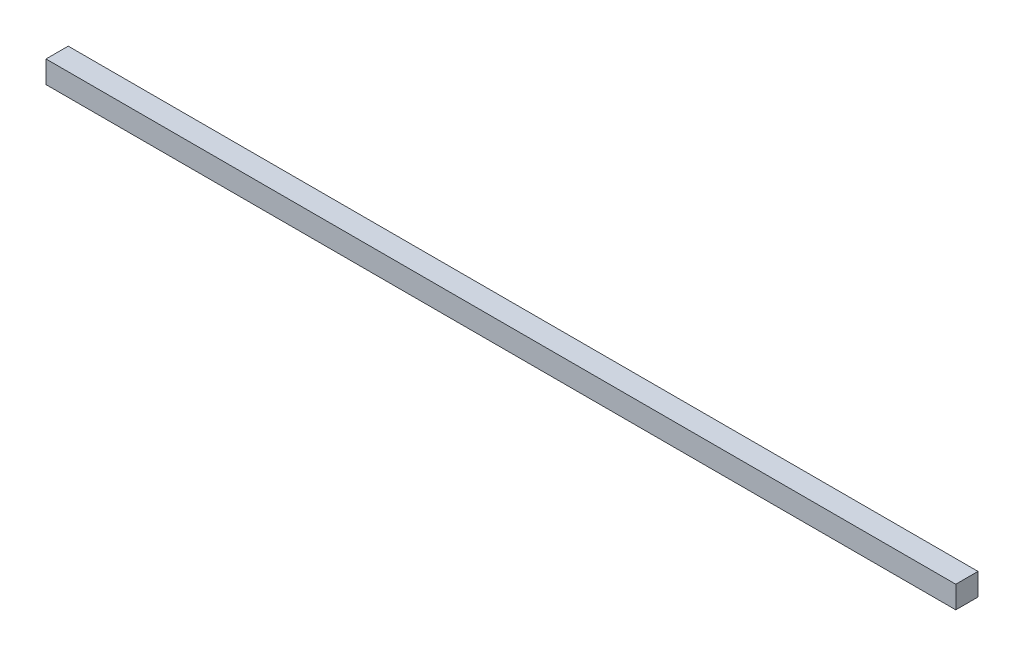
ISO-10303-21;
HEADER;
FILE_DESCRIPTION(('STEP AP214'),'2;1');
FILE_NAME('part.step','',(''),(''),'','','');
FILE_SCHEMA(('AUTOMOTIVE_DESIGN { 1 0 10303 214 1 1 1 1 }'));
ENDSEC;
DATA;
#1=APPLICATION_CONTEXT('core data for automotive mechanical design processes');
#2=APPLICATION_PROTOCOL_DEFINITION('international standard','automotive_design',2000,#1);
#3=PRODUCT_CONTEXT('',#1,'mechanical');
#4=PRODUCT('Part','Part','',(#3));
#5=PRODUCT_RELATED_PRODUCT_CATEGORY('part','',(#4));
#6=PRODUCT_DEFINITION_FORMATION('','',#4);
#7=PRODUCT_DEFINITION_CONTEXT('part definition',#1,'design');
#8=PRODUCT_DEFINITION('design','',#6,#7);
#9=PRODUCT_DEFINITION_SHAPE('','',#8);
#10=(LENGTH_UNIT() NAMED_UNIT(*) SI_UNIT(.MILLI.,.METRE.));
#11=(NAMED_UNIT(*) PLANE_ANGLE_UNIT() SI_UNIT($,.RADIAN.));
#12=(NAMED_UNIT(*) SI_UNIT($,.STERADIAN.) SOLID_ANGLE_UNIT());
#13=UNCERTAINTY_MEASURE_WITH_UNIT(LENGTH_MEASURE(1.E-05),#10,'distance_accuracy_value','');
#14=(GEOMETRIC_REPRESENTATION_CONTEXT(3) GLOBAL_UNCERTAINTY_ASSIGNED_CONTEXT((#13)) GLOBAL_UNIT_ASSIGNED_CONTEXT((#10,
#11,#12)) REPRESENTATION_CONTEXT('',''));
#15=CARTESIAN_POINT('',(0.,0.,0.));
#16=DIRECTION('',(0.,0.,1.));
#17=DIRECTION('',(1.,0.,0.));
#18=AXIS2_PLACEMENT_3D('',#15,#16,#17);
#19=CARTESIAN_POINT('',(64.9999999999999,-1.5875,1.5875));
#20=DIRECTION('',(0.,1.,0.));
#21=DIRECTION('',(0.,0.,1.));
#22=AXIS2_PLACEMENT_3D('',#19,#20,#21);
#23=PLANE('',#22);
#24=DIRECTION('',(-1.,0.,0.));
#25=VECTOR('',#24,1.);
#26=CARTESIAN_POINT('',(64.9999999999999,-1.5875,1.5875));
#27=LINE('',#26,#25);
#28=CARTESIAN_POINT('',(64.9999999999999,-1.5875,1.5875));
#29=VERTEX_POINT('',#28);
#30=CARTESIAN_POINT('',(-64.9999999999999,-1.5875,1.5875));
#31=VERTEX_POINT('',#30);
#32=EDGE_CURVE('E98',#29,#31,#27,.T.);
#33=ORIENTED_EDGE('',*,*,#32,.T.);
#34=DIRECTION('',(0.,0.,-1.));
#35=VECTOR('',#34,1.);
#36=CARTESIAN_POINT('',(-64.9999999999999,-1.5875,1.5875));
#37=LINE('',#36,#35);
#38=CARTESIAN_POINT('',(-64.9999999999999,-1.5875,-1.5875));
#39=VERTEX_POINT('',#38);
#40=EDGE_CURVE('E93',#31,#39,#37,.T.);
#41=ORIENTED_EDGE('',*,*,#40,.T.);
#42=DIRECTION('',(-1.,0.,0.));
#43=VECTOR('',#42,1.);
#44=CARTESIAN_POINT('',(64.9999999999999,-1.5875,-1.5875));
#45=LINE('',#44,#43);
#46=CARTESIAN_POINT('',(64.9999999999999,-1.5875,-1.5875));
#47=VERTEX_POINT('',#46);
#48=EDGE_CURVE('E11',#47,#39,#45,.T.);
#49=ORIENTED_EDGE('',*,*,#48,.F.);
#50=DIRECTION('',(0.,0.,-1.));
#51=VECTOR('',#50,1.);
#52=CARTESIAN_POINT('',(64.9999999999999,-1.5875,1.5875));
#53=LINE('',#52,#51);
#54=EDGE_CURVE('E104',#29,#47,#53,.T.);
#55=ORIENTED_EDGE('',*,*,#54,.F.);
#56=EDGE_LOOP('',(#33,#41,#49,#55));
#57=FACE_BOUND('',#56,.T.);
#58=ADVANCED_FACE('F41',(#57),#23,.F.);
#59=CARTESIAN_POINT('',(64.9999999999999,-1.5875,-1.5875));
#60=DIRECTION('',(0.,0.,1.));
#61=DIRECTION('',(1.,0.,0.));
#62=AXIS2_PLACEMENT_3D('',#59,#60,#61);
#63=PLANE('',#62);
#64=ORIENTED_EDGE('',*,*,#48,.T.);
#65=DIRECTION('',(0.,1.,0.));
#66=VECTOR('',#65,1.);
#67=CARTESIAN_POINT('',(-64.9999999999999,-1.5875,-1.5875));
#68=LINE('',#67,#66);
#69=CARTESIAN_POINT('',(-64.9999999999999,1.5875,-1.5875));
#70=VERTEX_POINT('',#69);
#71=EDGE_CURVE('E83',#39,#70,#68,.T.);
#72=ORIENTED_EDGE('',*,*,#71,.T.);
#73=DIRECTION('',(-1.,0.,0.));
#74=VECTOR('',#73,1.);
#75=CARTESIAN_POINT('',(64.9999999999999,1.5875,-1.5875));
#76=LINE('',#75,#74);
#77=CARTESIAN_POINT('',(64.9999999999999,1.5875,-1.5875));
#78=VERTEX_POINT('',#77);
#79=EDGE_CURVE('E48',#78,#70,#76,.T.);
#80=ORIENTED_EDGE('',*,*,#79,.F.);
#81=DIRECTION('',(0.,1.,0.));
#82=VECTOR('',#81,1.);
#83=CARTESIAN_POINT('',(64.9999999999999,-1.5875,-1.5875));
#84=LINE('',#83,#82);
#85=EDGE_CURVE('E84',#47,#78,#84,.T.);
#86=ORIENTED_EDGE('',*,*,#85,.F.);
#87=EDGE_LOOP('',(#64,#72,#80,#86));
#88=FACE_BOUND('',#87,.T.);
#89=ADVANCED_FACE('F81',(#88),#63,.F.);
#90=CARTESIAN_POINT('',(64.9999999999999,1.5875,1.5875));
#91=DIRECTION('',(0.,-1.,0.));
#92=DIRECTION('',(0.,0.,-1.));
#93=AXIS2_PLACEMENT_3D('',#90,#91,#92);
#94=PLANE('',#93);
#95=ORIENTED_EDGE('',*,*,#79,.T.);
#96=DIRECTION('',(0.,0.,1.));
#97=VECTOR('',#96,1.);
#98=CARTESIAN_POINT('',(-64.9999999999999,1.5875,1.5875));
#99=LINE('',#98,#97);
#100=CARTESIAN_POINT('',(-64.9999999999999,1.5875,1.5875));
#101=VERTEX_POINT('',#100);
#102=EDGE_CURVE('E96',#70,#101,#99,.T.);
#103=ORIENTED_EDGE('',*,*,#102,.T.);
#104=DIRECTION('',(-1.,0.,0.));
#105=VECTOR('',#104,1.);
#106=CARTESIAN_POINT('',(64.9999999999999,1.5875,1.5875));
#107=LINE('',#106,#105);
#108=CARTESIAN_POINT('',(64.9999999999999,1.5875,1.5875));
#109=VERTEX_POINT('',#108);
#110=EDGE_CURVE('E110',#109,#101,#107,.T.);
#111=ORIENTED_EDGE('',*,*,#110,.F.);
#112=DIRECTION('',(0.,0.,1.));
#113=VECTOR('',#112,1.);
#114=CARTESIAN_POINT('',(64.9999999999999,1.5875,1.5875));
#115=LINE('',#114,#113);
#116=EDGE_CURVE('E60',#78,#109,#115,.T.);
#117=ORIENTED_EDGE('',*,*,#116,.F.);
#118=EDGE_LOOP('',(#95,#103,#111,#117));
#119=FACE_BOUND('',#118,.T.);
#120=ADVANCED_FACE('F112',(#119),#94,.F.);
#121=CARTESIAN_POINT('',(64.9999999999999,-1.5875,1.5875));
#122=DIRECTION('',(0.,0.,-1.));
#123=DIRECTION('',(-1.,0.,0.));
#124=AXIS2_PLACEMENT_3D('',#121,#122,#123);
#125=PLANE('',#124);
#126=ORIENTED_EDGE('',*,*,#110,.T.);
#127=DIRECTION('',(0.,-1.,0.));
#128=VECTOR('',#127,1.);
#129=CARTESIAN_POINT('',(-64.9999999999999,-1.5875,1.5875));
#130=LINE('',#129,#128);
#131=EDGE_CURVE('E102',#101,#31,#130,.T.);
#132=ORIENTED_EDGE('',*,*,#131,.T.);
#133=ORIENTED_EDGE('',*,*,#32,.F.);
#134=DIRECTION('',(0.,-1.,0.));
#135=VECTOR('',#134,1.);
#136=CARTESIAN_POINT('',(64.9999999999999,-1.5875,1.5875));
#137=LINE('',#136,#135);
#138=EDGE_CURVE('E55',#109,#29,#137,.T.);
#139=ORIENTED_EDGE('',*,*,#138,.F.);
#140=EDGE_LOOP('',(#126,#132,#133,#139));
#141=FACE_BOUND('',#140,.T.);
#142=ADVANCED_FACE('F114',(#141),#125,.F.);
#143=CARTESIAN_POINT('',(64.9999999999999,0.,0.));
#144=DIRECTION('',(1.,0.,0.));
#145=DIRECTION('',(0.,0.,-1.));
#146=AXIS2_PLACEMENT_3D('',#143,#144,#145);
#147=PLANE('',#146);
#148=ORIENTED_EDGE('',*,*,#54,.T.);
#149=ORIENTED_EDGE('',*,*,#85,.T.);
#150=ORIENTED_EDGE('',*,*,#116,.T.);
#151=ORIENTED_EDGE('',*,*,#138,.T.);
#152=EDGE_LOOP('',(#148,#149,#150,#151));
#153=FACE_BOUND('',#152,.T.);
#154=ADVANCED_FACE('F115',(#153),#147,.T.);
#155=CARTESIAN_POINT('',(-64.9999999999999,0.,0.));
#156=DIRECTION('',(1.,0.,0.));
#157=DIRECTION('',(0.,0.,-1.));
#158=AXIS2_PLACEMENT_3D('',#155,#156,#157);
#159=PLANE('',#158);
#160=ORIENTED_EDGE('',*,*,#40,.F.);
#161=ORIENTED_EDGE('',*,*,#131,.F.);
#162=ORIENTED_EDGE('',*,*,#102,.F.);
#163=ORIENTED_EDGE('',*,*,#71,.F.);
#164=EDGE_LOOP('',(#160,#161,#162,#163));
#165=FACE_BOUND('',#164,.T.);
#166=ADVANCED_FACE('F91',(#165),#159,.F.);
#167=CLOSED_SHELL('',(#58,#89,#120,#142,#154,#166));
#168=MANIFOLD_SOLID_BREP('B2',#167);
#169=ADVANCED_BREP_SHAPE_REPRESENTATION('',(#18,#168),#14);
#170=SHAPE_DEFINITION_REPRESENTATION(#9,#169);
ENDSEC;
END-ISO-10303-21;
